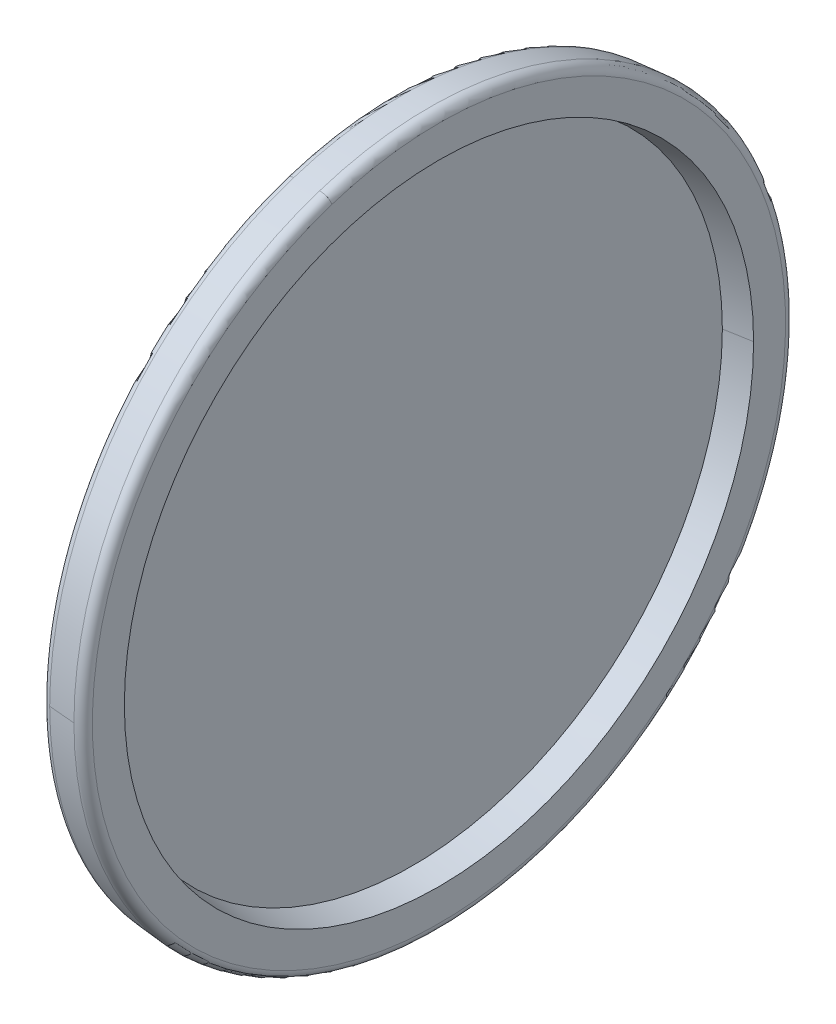
ISO-10303-21;
HEADER;
FILE_DESCRIPTION(('STEP AP214'),'2;1');
FILE_NAME('part.step','',(''),(''),'','','');
FILE_SCHEMA(('AUTOMOTIVE_DESIGN { 1 0 10303 214 1 1 1 1 }'));
ENDSEC;
DATA;
#1=APPLICATION_CONTEXT('core data for automotive mechanical design processes');
#2=APPLICATION_PROTOCOL_DEFINITION('international standard','automotive_design',2000,#1);
#3=PRODUCT_CONTEXT('',#1,'mechanical');
#4=PRODUCT('Part','Part','',(#3));
#5=PRODUCT_RELATED_PRODUCT_CATEGORY('part','',(#4));
#6=PRODUCT_DEFINITION_FORMATION('','',#4);
#7=PRODUCT_DEFINITION_CONTEXT('part definition',#1,'design');
#8=PRODUCT_DEFINITION('design','',#6,#7);
#9=PRODUCT_DEFINITION_SHAPE('','',#8);
#10=(LENGTH_UNIT() NAMED_UNIT(*) SI_UNIT(.MILLI.,.METRE.));
#11=(NAMED_UNIT(*) PLANE_ANGLE_UNIT() SI_UNIT($,.RADIAN.));
#12=(NAMED_UNIT(*) SI_UNIT($,.STERADIAN.) SOLID_ANGLE_UNIT());
#13=UNCERTAINTY_MEASURE_WITH_UNIT(LENGTH_MEASURE(1.E-05),#10,'distance_accuracy_value','');
#14=(GEOMETRIC_REPRESENTATION_CONTEXT(3) GLOBAL_UNCERTAINTY_ASSIGNED_CONTEXT((#13)) GLOBAL_UNIT_ASSIGNED_CONTEXT((#10,
#11,#12)) REPRESENTATION_CONTEXT('',''));
#15=CARTESIAN_POINT('',(0.,0.,0.));
#16=DIRECTION('',(0.,0.,1.));
#17=DIRECTION('',(1.,0.,0.));
#18=AXIS2_PLACEMENT_3D('',#15,#16,#17);
#19=CARTESIAN_POINT('',(0.,0.,0.));
#20=DIRECTION('',(1.,0.,0.));
#21=DIRECTION('',(0.,0.,-1.));
#22=AXIS2_PLACEMENT_3D('',#19,#20,#21);
#23=PLANE('',#22);
#24=CARTESIAN_POINT('',(0.,36.9925087290053,12.0195946991215));
#25=CARTESIAN_POINT('',(0.,36.7958512117207,12.6248879908821));
#26=CARTESIAN_POINT('',(0.,36.5843128120488,13.2253449829847));
#27=CARTESIAN_POINT('',(0.,36.1320393357843,14.415160900574));
#28=CARTESIAN_POINT('',(0.,35.8913042591917,15.0045198260607));
#29=CARTESIAN_POINT('',(0.,35.3812025169398,16.1707141431178));
#30=CARTESIAN_POINT('',(0.,35.1118358512804,16.7475495346883));
#31=CARTESIAN_POINT('',(0.,34.5451238415914,17.8873086508502));
#32=CARTESIAN_POINT('',(0.,34.2477784975618,18.4502323754416));
#33=CARTESIAN_POINT('',(0.,33.6258243949211,19.5608116194327));
#34=CARTESIAN_POINT('',(0.,33.3012156363099,20.1084671388325));
#35=CARTESIAN_POINT('',(0.,32.6255170013905,21.1871907310197));
#36=CARTESIAN_POINT('',(0.,32.2744271250823,21.7182588038072));
#37=CARTESIAN_POINT('',(0.,31.5466119844118,22.762528084142));
#38=CARTESIAN_POINT('',(0.,31.1698867200495,23.2757292916892));
#39=CARTESIAN_POINT('',(0.,30.3917083879606,24.2830285026871));
#40=CARTESIAN_POINT('',(0.,29.9902553202339,24.7771265061379));
#41=CARTESIAN_POINT('',(0.,29.1635885115182,25.7450289814837));
#42=CARTESIAN_POINT('',(0.,28.7383747705292,26.2188334533788));
#43=CARTESIAN_POINT('',(0.,27.8652109939093,27.1450074297003));
#44=CARTESIAN_POINT('',(0.,27.4172609582785,27.5973769341267));
#45=CARTESIAN_POINT('',(0.,26.4997037428515,28.4795911776019));
#46=CARTESIAN_POINT('',(0.,26.0300965630554,28.9094359166507));
#47=CARTESIAN_POINT('',(0.,25.0703563842326,29.7455650957842));
#48=CARTESIAN_POINT('',(0.,24.5802233852059,30.1518495358691));
#49=CARTESIAN_POINT('',(0.,23.5806123412189,30.9398793422617));
#50=CARTESIAN_POINT('',(0.,23.0711342962586,31.3216247085695));
#51=CARTESIAN_POINT('',(0.,22.0340605376472,32.0596567093864));
#52=CARTESIAN_POINT('',(0.,21.5064648239962,32.4159433438956));
#53=CARTESIAN_POINT('',(0.,20.4344267522873,33.1021995554049));
#54=CARTESIAN_POINT('',(0.,19.8899843942296,33.4321691324052));
#55=CARTESIAN_POINT('',(0.,18.7855646430361,34.064996303284));
#56=CARTESIAN_POINT('',(0.,18.2255872499003,34.3678538971626));
#57=CARTESIAN_POINT('',(0.,17.0914464631388,34.9457274913272));
#58=CARTESIAN_POINT('',(0.,16.5172830695131,35.2207434916132));
#59=CARTESIAN_POINT('',(0.,15.3561534916778,35.7422713609596));
#60=CARTESIAN_POINT('',(0.,14.7691873074682,35.9887832300198));
#61=CARTESIAN_POINT('',(0.,13.5838662014152,36.4527089682302));
#62=CARTESIAN_POINT('',(0.,12.9855112795717,36.6701228373802));
#63=CARTESIAN_POINT('',(0.,11.7788541876673,37.0753288067161));
#64=CARTESIAN_POINT('',(0.,11.1705520176063,37.2631209069019));
#65=CARTESIAN_POINT('',(0.,9.94546588247545,37.6086309306914));
#66=CARTESIAN_POINT('',(0.,9.32868191740561,37.766348854295));
#67=CARTESIAN_POINT('',(0.,8.08811807885282,38.0513305686276));
#68=CARTESIAN_POINT('',(0.,7.46433820536987,38.1785943593566));
#69=CARTESIAN_POINT('',(0.,6.21128529034277,38.4023612183211));
#70=CARTESIAN_POINT('',(0.,5.5820122487986,38.4988642865566));
#71=CARTESIAN_POINT('',(0.,4.31948897152394,38.66087721619));
#72=CARTESIAN_POINT('',(0.,3.68623873579344,38.726387077588));
#73=CARTESIAN_POINT('',(0.,2.41728662543016,38.8262557745523));
#74=CARTESIAN_POINT('',(0.,1.78158475079737,38.8606146101186));
#75=CARTESIAN_POINT('',(0.,0.509260824126409,38.8980984819753));
#76=CARTESIAN_POINT('',(0.,-0.127361227911758,38.9012235182656));
#77=CARTESIAN_POINT('',(0.,-1.39999183110863,38.8762322630842));
#78=CARTESIAN_POINT('',(0.,-2.03600038226733,38.8481159716124));
#79=CARTESIAN_POINT('',(0.,-3.30587178339773,38.7607097955155));
#80=CARTESIAN_POINT('',(0.,-3.93973463336944,38.7014199108905));
#81=CARTESIAN_POINT('',(0.,-5.20378760100046,38.5518093830123));
#82=CARTESIAN_POINT('',(0.,-5.83397771865978,38.4614887397592));
#83=CARTESIAN_POINT('',(0.,-7.08916703847443,38.2500342849656));
#84=CARTESIAN_POINT('',(0.,-7.71416624062976,38.1289004734252));
#85=CARTESIAN_POINT('',(0.,-8.95746805161499,37.8561115040192));
#86=CARTESIAN_POINT('',(0.,-9.57577066044489,37.7044563461536));
#87=CARTESIAN_POINT('',(0.,-10.8041897396377,37.3709900346559));
#88=CARTESIAN_POINT('',(0.,-11.4143062100006,37.1891788810237));
#89=CARTESIAN_POINT('',(0.,-12.6248831882423,36.7958385769869));
#90=CARTESIAN_POINT('',(0.,-13.2253436961212,36.5843094265821));
#91=CARTESIAN_POINT('',(0.,-14.4151621874374,36.1320427212511));
#92=CARTESIAN_POINT('',(0.,-15.0045201708746,35.8913051663248));
#93=CARTESIAN_POINT('',(0.,-16.1707137983037,35.3812016098067));
#94=CARTESIAN_POINT('',(0.,-16.7475494422956,35.1118356082148));
#95=CARTESIAN_POINT('',(0.,-17.8873087432428,34.545124084657));
#96=CARTESIAN_POINT('',(0.,-18.4502324001981,34.2477785626911));
#97=CARTESIAN_POINT('',(0.,-19.5608115946761,33.6258243297919));
#98=CARTESIAN_POINT('',(0.,-20.1084671321989,33.3012156188586));
#99=CARTESIAN_POINT('',(0.,-21.1871907376532,32.6255170188419));
#100=CARTESIAN_POINT('',(0.,-21.7182588055846,32.2744271297584));
#101=CARTESIAN_POINT('',(0.,-22.7625280823645,31.5466119797358));
#102=CARTESIAN_POINT('',(0.,-23.2757292912129,31.1698867187966));
#103=CARTESIAN_POINT('',(0.,-24.2830285031634,30.3917083892136));
#104=CARTESIAN_POINT('',(0.,-24.7771265062655,29.9902553205697));
#105=CARTESIAN_POINT('',(0.,-25.745028981356,29.1635885111825));
#106=CARTESIAN_POINT('',(0.,-26.2188334533445,28.7383747704393));
#107=CARTESIAN_POINT('',(0.,-27.1450074297344,27.8652109939993));
#108=CARTESIAN_POINT('',(0.,-27.5973769341359,27.4172609583026));
#109=CARTESIAN_POINT('',(0.,-28.4795911775927,26.4997037428274));
#110=CARTESIAN_POINT('',(0.,-28.9094359166482,26.0300965630489));
#111=CARTESIAN_POINT('',(0.,-29.7455650957867,25.0703563842391));
#112=CARTESIAN_POINT('',(0.,-30.1518495358697,24.5802233852077));
#113=CARTESIAN_POINT('',(0.,-30.939879342261,23.5806123412173));
#114=CARTESIAN_POINT('',(0.,-31.3216247085693,23.0711342962582));
#115=CARTESIAN_POINT('',(0.,-32.0596567093865,22.0340605376477));
#116=CARTESIAN_POINT('',(0.,-32.4159433438956,21.5064648239963));
#117=CARTESIAN_POINT('',(0.,-33.1021995554048,20.4344267522873));
#118=CARTESIAN_POINT('',(0.,-33.4321691324051,19.8899843942296));
#119=CARTESIAN_POINT('',(0.,-34.0649963032839,18.7855646430361));
#120=CARTESIAN_POINT('',(0.,-34.3678538971625,18.2255872499003));
#121=CARTESIAN_POINT('',(0.,-34.9457274913271,17.0914464631388));
#122=CARTESIAN_POINT('',(0.,-35.2207434916132,16.5172830695131));
#123=CARTESIAN_POINT('',(0.,-35.7422713609596,15.3561534916778));
#124=CARTESIAN_POINT('',(0.,-35.9887832300199,14.7691873074683));
#125=CARTESIAN_POINT('',(0.,-36.45270896823,13.5838662014153));
#126=CARTESIAN_POINT('',(0.,-36.6701228373797,12.9855112795719));
#127=CARTESIAN_POINT('',(0.,-37.0753288067165,11.7788541876672));
#128=CARTESIAN_POINT('',(0.,-37.2631209069037,11.1705520176059));
#129=CARTESIAN_POINT('',(0.,-37.6086309306896,9.94546588247601));
#130=CARTESIAN_POINT('',(0.,-37.7663488542883,9.3286819174075));
#131=CARTESIAN_POINT('',(0.,-38.0513305686342,8.0881180788511));
#132=CARTESIAN_POINT('',(0.,-38.1785943593814,7.4643382053632));
#133=CARTESIAN_POINT('',(0.,-38.4023612182962,6.2112852903496));
#134=CARTESIAN_POINT('',(0.,-38.4988642864637,5.5820122488239));
#135=CARTESIAN_POINT('',(0.,-38.6608772162829,4.31948897149882));
#136=CARTESIAN_POINT('',(0.,-38.7263870779346,3.68623873569943));
#137=CARTESIAN_POINT('',(0.,-38.8262557742057,2.41728662552432));
#138=CARTESIAN_POINT('',(0.,-38.860614608825,1.78158475114861));
#139=CARTESIAN_POINT('',(0.,-38.8980984832689,0.509260823775332));
#140=CARTESIAN_POINT('',(0.,-38.9012235230934,-0.127361229222226));
#141=CARTESIAN_POINT('',(0.,-38.8762322582564,-1.399991829798));
#142=CARTESIAN_POINT('',(0.,-38.8481159535949,-2.03600037737622));
#143=CARTESIAN_POINT('',(0.,-38.760709813533,-3.30587178828867));
#144=CARTESIAN_POINT('',(0.,-38.7014199781326,-3.9397346516229));
#145=CARTESIAN_POINT('',(0.,-38.5518093157701,-5.20378758274683));
#146=CARTESIAN_POINT('',(0.,-38.4614884888079,-5.83397765053653));
#147=CARTESIAN_POINT('',(0.,-38.2500345359169,-7.08916710659747));
#148=CARTESIAN_POINT('',(0.,-38.1289014099879,-7.71416649486871));
#149=CARTESIAN_POINT('',(0.,-37.8561105674566,-8.95746779737585));
#150=CARTESIAN_POINT('',(0.,-37.7044528508542,-9.57576971161175));
#151=CARTESIAN_POINT('',(0.,-37.3709935299553,-10.8041906884706));
#152=CARTESIAN_POINT('',(0.,-37.1891919256589,-11.4143097510936));
#153=CARTESIAN_POINT('',(0.,-36.9925087290053,-12.0195946991214));
#154=B_SPLINE_CURVE_WITH_KNOTS('',3,(#24,#25,#26,#27,#28,#29,#30,#31,#32,#33,#34,#35,#36,#37,
#38,#39,#40,#41,#42,#43,#44,#45,#46,#47,#48,#49,#50,#51,#52,#53,#54,#55,#56,#57,#58,#59,#60,#61,
#62,#63,#64,#65,#66,#67,#68,#69,#70,#71,#72,#73,#74,#75,#76,#77,#78,#79,#80,#81,#82,#83,#84,#85,
#86,#87,#88,#89,#90,#91,#92,#93,#94,#95,#96,#97,#98,#99,#100,#101,#102,#103,#104,#105,#106,#107,
#108,#109,#110,#111,#112,#113,#114,#115,#116,#117,#118,#119,#120,#121,#122,#123,#124,#125,#126,
#127,#128,#129,#130,#131,#132,#133,#134,#135,#136,#137,#138,#139,#140,#141,#142,#143,#144,#145,
#146,#147,#148,#149,#150,#151,#152,#153),.UNSPECIFIED.,.F.,.F.,(4,2,2,2,2,2,2,2,2,2,2,2,2,2,2,2,
2,2,2,2,2,2,2,2,2,2,2,2,2,2,2,2,2,2,2,2,2,2,2,2,2,2,2,2,2,2,2,2,2,2,2,2,2,2,2,2,2,2,2,2,2,2,2,2,
4),(0.,1.90912231775846,3.81824463551692,5.72736695327538,7.63648927103384,9.5456115887923,
11.4547339065508,13.3638562243092,15.2729785420677,17.1821008598262,19.0912231775846,
21.0003454953431,22.9094678131015,24.81859013086,26.7277124486184,28.6368347663769,
30.5459570841354,32.4550794018938,34.3642017196523,36.2733240374108,38.1824463551692,
40.0915686729277,42.0006909906861,43.9098133084446,45.818935626203,47.7280579439615,
49.6371802617199,51.5463025794784,53.4554248972369,55.3645472149953,57.2736695327538,
59.1827918505122,61.0919141682707,63.0010364860292,64.9101588037876,66.8192811215461,
68.7284034393045,70.637525757063,72.5466480748215,74.4557703925799,76.3648927103384,
78.2740150280968,80.1831373458553,82.0922596636138,84.0013819813722,85.9105042991307,
87.8196266168891,89.7287489346476,91.6378712524061,93.5469935701645,95.456115887923,
97.3652382056814,99.2743605234399,101.183482841198,103.092605158957,105.001727476715,
106.910849794474,108.819972112232,110.729094429991,112.638216747749,114.547339065508,
116.456461383266,118.365583701024,120.274706018783,122.183828336541),.UNSPECIFIED.);
#155=CARTESIAN_POINT('',(0.,36.9925087290053,12.0195946991215));
#156=VERTEX_POINT('',#155);
#157=CARTESIAN_POINT('',(0.,-36.9925087290053,-12.0195946991215));
#158=VERTEX_POINT('',#157);
#159=EDGE_CURVE('E11',#156,#158,#154,.T.);
#160=ORIENTED_EDGE('',*,*,#159,.F.);
#161=CARTESIAN_POINT('',(0.,-36.9925087290053,-12.0195946991215));
#162=CARTESIAN_POINT('',(0.,-36.7958512117207,-12.6248879908821));
#163=CARTESIAN_POINT('',(0.,-36.5843128120488,-13.2253449829847));
#164=CARTESIAN_POINT('',(0.,-36.1320393357843,-14.415160900574));
#165=CARTESIAN_POINT('',(0.,-35.8913042591917,-15.0045198260607));
#166=CARTESIAN_POINT('',(0.,-35.3812025169398,-16.1707141431178));
#167=CARTESIAN_POINT('',(0.,-35.1118358512804,-16.7475495346883));
#168=CARTESIAN_POINT('',(0.,-34.5451238415914,-17.8873086508502));
#169=CARTESIAN_POINT('',(0.,-34.2477784975618,-18.4502323754416));
#170=CARTESIAN_POINT('',(0.,-33.6258243949211,-19.5608116194327));
#171=CARTESIAN_POINT('',(0.,-33.3012156363099,-20.1084671388325));
#172=CARTESIAN_POINT('',(0.,-32.6255170013905,-21.1871907310197));
#173=CARTESIAN_POINT('',(0.,-32.2744271250823,-21.7182588038072));
#174=CARTESIAN_POINT('',(0.,-31.5466119844118,-22.762528084142));
#175=CARTESIAN_POINT('',(0.,-31.1698867200495,-23.2757292916892));
#176=CARTESIAN_POINT('',(0.,-30.3917083879606,-24.2830285026871));
#177=CARTESIAN_POINT('',(0.,-29.9902553202339,-24.7771265061379));
#178=CARTESIAN_POINT('',(0.,-29.1635885115182,-25.7450289814837));
#179=CARTESIAN_POINT('',(0.,-28.7383747705292,-26.2188334533787));
#180=CARTESIAN_POINT('',(0.,-27.8652109939093,-27.1450074297003));
#181=CARTESIAN_POINT('',(0.,-27.4172609582785,-27.5973769341267));
#182=CARTESIAN_POINT('',(0.,-26.4997037428515,-28.4795911776019));
#183=CARTESIAN_POINT('',(0.,-26.0300965630554,-28.9094359166506));
#184=CARTESIAN_POINT('',(0.,-25.0703563842326,-29.7455650957842));
#185=CARTESIAN_POINT('',(0.,-24.5802233852059,-30.1518495358691));
#186=CARTESIAN_POINT('',(0.,-23.580612341219,-30.9398793422617));
#187=CARTESIAN_POINT('',(0.,-23.0711342962586,-31.3216247085695));
#188=CARTESIAN_POINT('',(0.,-22.0340605376473,-32.0596567093864));
#189=CARTESIAN_POINT('',(0.,-21.5064648239962,-32.4159433438955));
#190=CARTESIAN_POINT('',(0.,-20.4344267522874,-33.1021995554049));
#191=CARTESIAN_POINT('',(0.,-19.8899843942296,-33.4321691324051));
#192=CARTESIAN_POINT('',(0.,-18.7855646430361,-34.064996303284));
#193=CARTESIAN_POINT('',(0.,-18.2255872499003,-34.3678538971625));
#194=CARTESIAN_POINT('',(0.,-17.0914464631388,-34.9457274913272));
#195=CARTESIAN_POINT('',(0.,-16.5172830695131,-35.2207434916132));
#196=CARTESIAN_POINT('',(0.,-15.3561534916778,-35.7422713609596));
#197=CARTESIAN_POINT('',(0.,-14.7691873074683,-35.9887832300198));
#198=CARTESIAN_POINT('',(0.,-13.5838662014152,-36.4527089682302));
#199=CARTESIAN_POINT('',(0.,-12.9855112795718,-36.6701228373802));
#200=CARTESIAN_POINT('',(0.,-11.7788541876673,-37.0753288067161));
#201=CARTESIAN_POINT('',(0.,-11.1705520176063,-37.2631209069019));
#202=CARTESIAN_POINT('',(0.,-9.94546588247548,-37.6086309306914));
#203=CARTESIAN_POINT('',(0.,-9.32868191740564,-37.766348854295));
#204=CARTESIAN_POINT('',(0.,-8.08811807885286,-38.0513305686276));
#205=CARTESIAN_POINT('',(0.,-7.46433820536991,-38.1785943593566));
#206=CARTESIAN_POINT('',(0.,-6.2112852903428,-38.4023612183211));
#207=CARTESIAN_POINT('',(0.,-5.58201224879864,-38.4988642865566));
#208=CARTESIAN_POINT('',(0.,-4.31948897152398,-38.66087721619));
#209=CARTESIAN_POINT('',(0.,-3.68623873579348,-38.726387077588));
#210=CARTESIAN_POINT('',(0.,-2.4172866254302,-38.8262557745523));
#211=CARTESIAN_POINT('',(0.,-1.7815847507974,-38.8606146101186));
#212=CARTESIAN_POINT('',(0.,-0.509260824126441,-38.8980984819753));
#213=CARTESIAN_POINT('',(0.,0.127361227911731,-38.9012235182656));
#214=CARTESIAN_POINT('',(0.,1.3999918311086,-38.8762322630842));
#215=CARTESIAN_POINT('',(0.,2.03600038226729,-38.8481159716124));
#216=CARTESIAN_POINT('',(0.,3.3058717833977,-38.7607097955155));
#217=CARTESIAN_POINT('',(0.,3.9397346333694,-38.7014199108905));
#218=CARTESIAN_POINT('',(0.,5.20378760100041,-38.5518093830123));
#219=CARTESIAN_POINT('',(0.,5.83397771865972,-38.4614887397592));
#220=CARTESIAN_POINT('',(0.,7.08916703847437,-38.2500342849657));
#221=CARTESIAN_POINT('',(0.,7.71416624062971,-38.1289004734252));
#222=CARTESIAN_POINT('',(0.,8.95746805161496,-37.8561115040192));
#223=CARTESIAN_POINT('',(0.,9.57577066044486,-37.7044563461536));
#224=CARTESIAN_POINT('',(0.,10.8041897396376,-37.3709900346559));
#225=CARTESIAN_POINT('',(0.,11.4143062100005,-37.1891788810237));
#226=CARTESIAN_POINT('',(0.,12.6248831882423,-36.7958385769869));
#227=CARTESIAN_POINT('',(0.,13.2253436961212,-36.5843094265821));
#228=CARTESIAN_POINT('',(0.,14.4151621874373,-36.1320427212511));
#229=CARTESIAN_POINT('',(0.,15.0045201708746,-35.8913051663248));
#230=CARTESIAN_POINT('',(0.,16.1707137983037,-35.3812016098067));
#231=CARTESIAN_POINT('',(0.,16.7475494422956,-35.1118356082148));
#232=CARTESIAN_POINT('',(0.,17.8873087432427,-34.545124084657));
#233=CARTESIAN_POINT('',(0.,18.450232400198,-34.2477785626911));
#234=CARTESIAN_POINT('',(0.,19.5608115946761,-33.6258243297919));
#235=CARTESIAN_POINT('',(0.,20.1084671321989,-33.3012156188587));
#236=CARTESIAN_POINT('',(0.,21.1871907376531,-32.6255170188419));
#237=CARTESIAN_POINT('',(0.,21.7182588055846,-32.2744271297584));
#238=CARTESIAN_POINT('',(0.,22.7625280823644,-31.5466119797358));
#239=CARTESIAN_POINT('',(0.,23.2757292912128,-31.1698867187967));
#240=CARTESIAN_POINT('',(0.,24.2830285031633,-30.3917083892136));
#241=CARTESIAN_POINT('',(0.,24.7771265062654,-29.9902553205697));
#242=CARTESIAN_POINT('',(0.,25.745028981356,-29.1635885111825));
#243=CARTESIAN_POINT('',(0.,26.2188334533445,-28.7383747704393));
#244=CARTESIAN_POINT('',(0.,27.1450074297344,-27.8652109939994));
#245=CARTESIAN_POINT('',(0.,27.5973769341358,-27.4172609583026));
#246=CARTESIAN_POINT('',(0.,28.4795911775927,-26.4997037428274));
#247=CARTESIAN_POINT('',(0.,28.9094359166481,-26.030096563049));
#248=CARTESIAN_POINT('',(0.,29.7455650957866,-25.0703563842391));
#249=CARTESIAN_POINT('',(0.,30.1518495358697,-24.5802233852077));
#250=CARTESIAN_POINT('',(0.,30.939879342261,-23.5806123412173));
#251=CARTESIAN_POINT('',(0.,31.3216247085692,-23.0711342962583));
#252=CARTESIAN_POINT('',(0.,32.0596567093865,-22.0340605376478));
#253=CARTESIAN_POINT('',(0.,32.4159433438955,-21.5064648239964));
#254=CARTESIAN_POINT('',(0.,33.1021995554048,-20.4344267522873));
#255=CARTESIAN_POINT('',(0.,33.4321691324051,-19.8899843942297));
#256=CARTESIAN_POINT('',(0.,34.0649963032839,-18.7855646430362));
#257=CARTESIAN_POINT('',(0.,34.3678538971625,-18.2255872499004));
#258=CARTESIAN_POINT('',(0.,34.9457274913271,-17.0914464631389));
#259=CARTESIAN_POINT('',(0.,35.2207434916131,-16.5172830695132));
#260=CARTESIAN_POINT('',(0.,35.7422713609596,-15.3561534916779));
#261=CARTESIAN_POINT('',(0.,35.9887832300199,-14.7691873074683));
#262=CARTESIAN_POINT('',(0.,36.45270896823,-13.5838662014154));
#263=CARTESIAN_POINT('',(0.,36.6701228373797,-12.985511279572));
#264=CARTESIAN_POINT('',(0.,37.0753288067165,-11.7788541876673));
#265=CARTESIAN_POINT('',(0.,37.2631209069037,-11.1705520176059));
#266=CARTESIAN_POINT('',(0.,37.6086309306895,-9.94546588247606));
#267=CARTESIAN_POINT('',(0.,37.7663488542883,-9.32868191740755));
#268=CARTESIAN_POINT('',(0.,38.0513305686342,-8.08811807885115));
#269=CARTESIAN_POINT('',(0.,38.1785943593814,-7.46433820536326));
#270=CARTESIAN_POINT('',(0.,38.4023612182962,-6.21128529034966));
#271=CARTESIAN_POINT('',(0.,38.4988642864637,-5.58201224882395));
#272=CARTESIAN_POINT('',(0.,38.6608772162829,-4.31948897149887));
#273=CARTESIAN_POINT('',(0.,38.7263870779346,-3.68623873569949));
#274=CARTESIAN_POINT('',(0.,38.8262557742057,-2.4172866255244));
#275=CARTESIAN_POINT('',(0.,38.860614608825,-1.78158475114868));
#276=CARTESIAN_POINT('',(0.,38.8980984832689,-0.509260823775407));
#277=CARTESIAN_POINT('',(0.,38.9012235230934,0.127361229222152));
#278=CARTESIAN_POINT('',(0.,38.8762322582564,1.39999182979793));
#279=CARTESIAN_POINT('',(0.,38.8481159535949,2.03600037737615));
#280=CARTESIAN_POINT('',(0.,38.760709813533,3.30587178828859));
#281=CARTESIAN_POINT('',(0.,38.7014199781326,3.93973465162282));
#282=CARTESIAN_POINT('',(0.,38.5518093157701,5.20378758274677));
#283=CARTESIAN_POINT('',(0.,38.461488488808,5.83397765053648));
#284=CARTESIAN_POINT('',(0.,38.2500345359169,7.08916710659743));
#285=CARTESIAN_POINT('',(0.,38.1289014099879,7.71416649486867));
#286=CARTESIAN_POINT('',(0.,37.8561105674566,8.95746779737581));
#287=CARTESIAN_POINT('',(0.,37.7044528508542,9.57576971161171));
#288=CARTESIAN_POINT('',(0.,37.3709935299553,10.8041906884706));
#289=CARTESIAN_POINT('',(0.,37.189191925659,11.4143097510936));
#290=CARTESIAN_POINT('',(0.,36.9925087290053,12.0195946991213));
#291=B_SPLINE_CURVE_WITH_KNOTS('',3,(#161,#162,#163,#164,#165,#166,#167,#168,#169,#170,#171,
#172,#173,#174,#175,#176,#177,#178,#179,#180,#181,#182,#183,#184,#185,#186,#187,#188,#189,#190,
#191,#192,#193,#194,#195,#196,#197,#198,#199,#200,#201,#202,#203,#204,#205,#206,#207,#208,#209,
#210,#211,#212,#213,#214,#215,#216,#217,#218,#219,#220,#221,#222,#223,#224,#225,#226,#227,#228,
#229,#230,#231,#232,#233,#234,#235,#236,#237,#238,#239,#240,#241,#242,#243,#244,#245,#246,#247,
#248,#249,#250,#251,#252,#253,#254,#255,#256,#257,#258,#259,#260,#261,#262,#263,#264,#265,#266,
#267,#268,#269,#270,#271,#272,#273,#274,#275,#276,#277,#278,#279,#280,#281,#282,#283,#284,#285,
#286,#287,#288,#289,#290),.UNSPECIFIED.,.F.,.F.,(4,2,2,2,2,2,2,2,2,2,2,2,2,2,2,2,2,2,2,2,2,2,2,
2,2,2,2,2,2,2,2,2,2,2,2,2,2,2,2,2,2,2,2,2,2,2,2,2,2,2,2,2,2,2,2,2,2,2,2,2,2,2,2,2,4),(0.,
1.90912231775846,3.81824463551691,5.72736695327538,7.63648927103383,9.5456115887923,
11.4547339065508,13.3638562243092,15.2729785420677,17.1821008598261,19.0912231775846,
21.000345495343,22.9094678131015,24.81859013086,26.7277124486184,28.6368347663769,
30.5459570841353,32.4550794018938,34.3642017196523,36.2733240374107,38.1824463551692,
40.0915686729276,42.0006909906861,43.9098133084445,45.818935626203,47.7280579439615,
49.6371802617199,51.5463025794784,53.4554248972368,55.3645472149953,57.2736695327538,
59.1827918505122,61.0919141682707,63.0010364860291,64.9101588037876,66.8192811215461,
68.7284034393045,70.637525757063,72.5466480748214,74.4557703925799,76.3648927103384,
78.2740150280968,80.1831373458553,82.0922596636137,84.0013819813722,85.9105042991306,
87.8196266168891,89.7287489346476,91.637871252406,93.5469935701645,95.4561158879229,
97.3652382056814,99.2743605234399,101.183482841198,103.092605158957,105.001727476715,
106.910849794474,108.819972112232,110.729094429991,112.638216747749,114.547339065508,
116.456461383266,118.365583701024,120.274706018783,122.183828336541),.UNSPECIFIED.);
#292=EDGE_CURVE('E27',#158,#156,#291,.T.);
#293=ORIENTED_EDGE('',*,*,#292,.F.);
#294=EDGE_LOOP('',(#160,#293));
#295=FACE_BOUND('',#294,.T.);
#296=ADVANCED_FACE('F17',(#295),#23,.F.);
#297=CARTESIAN_POINT('',(0.999999999999848,0.,0.));
#298=DIRECTION('',(1.,0.,0.));
#299=DIRECTION('',(0.,-0.309016994374947,0.951056516295154));
#300=AXIS2_PLACEMENT_3D('',#297,#298,#299);
#301=TOROIDAL_SURFACE('',#300,38.8962255083534,0.999999999999848);
#302=CARTESIAN_POINT('',(0.999999999999848,-36.9925087290053,-12.0195946991215));
#303=DIRECTION('',(0.,0.309016994374949,-0.951056516295153));
#304=DIRECTION('',(-0.087155742747526,-0.947437459118848,-0.307841091416575));
#305=AXIS2_PLACEMENT_3D('',#302,#303,#304);
#306=CIRCLE('',#305,0.999999999999846);
#307=CARTESIAN_POINT('',(0.912844257252335,-37.939946188124,-12.327435790538));
#308=VERTEX_POINT('',#307);
#309=EDGE_CURVE('E248',#308,#158,#306,.T.);
#310=ORIENTED_EDGE('',*,*,#309,.T.);
#311=ORIENTED_EDGE('',*,*,#292,.T.);
#312=CARTESIAN_POINT('',(0.999999999999848,36.9925087290053,12.0195946991215));
#313=DIRECTION('',(0.,-0.309016994374949,0.951056516295153));
#314=DIRECTION('',(-0.0871557427475251,0.947437459118848,0.307841091416575));
#315=AXIS2_PLACEMENT_3D('',#312,#313,#314);
#316=CIRCLE('',#315,0.999999999999846);
#317=CARTESIAN_POINT('',(0.912844257252336,37.939946188124,12.3274357905381));
#318=VERTEX_POINT('',#317);
#319=EDGE_CURVE('E243',#318,#156,#316,.T.);
#320=ORIENTED_EDGE('',*,*,#319,.F.);
#321=CARTESIAN_POINT('',(0.91284425725234,0.,0.));
#322=DIRECTION('',(1.,0.,0.));
#323=DIRECTION('',(0.,0.,-1.));
#324=AXIS2_PLACEMENT_3D('',#321,#322,#323);
#325=CIRCLE('',#324,39.892420206445);
#326=CARTESIAN_POINT('',(0.91284425725234,0.,-39.892420206445));
#327=VERTEX_POINT('',#326);
#328=EDGE_CURVE('E237',#327,#318,#325,.T.);
#329=ORIENTED_EDGE('',*,*,#328,.F.);
#330=CARTESIAN_POINT('',(0.91284425725234,0.,0.));
#331=DIRECTION('',(1.,0.,0.));
#332=DIRECTION('',(0.,0.,-1.));
#333=AXIS2_PLACEMENT_3D('',#330,#331,#332);
#334=CIRCLE('',#333,39.892420206445);
#335=EDGE_CURVE('E231',#308,#327,#334,.T.);
#336=ORIENTED_EDGE('',*,*,#335,.F.);
#337=EDGE_LOOP('',(#310,#311,#320,#329,#336));
#338=FACE_BOUND('',#337,.T.);
#339=ADVANCED_FACE('F255',(#338),#301,.T.);
#340=CARTESIAN_POINT('',(0.91284425725234,0.,0.));
#341=DIRECTION('',(1.,0.,0.));
#342=DIRECTION('',(0.,1.,0.));
#343=AXIS2_PLACEMENT_3D('',#340,#341,#342);
#344=CONICAL_SURFACE('',#343,39.892420206445,0.0872664625994641);
#345=DIRECTION('',(0.996194698091768,0.,0.0871557427474067));
#346=VECTOR('',#345,1.);
#347=CARTESIAN_POINT('',(0.912844257252397,0.,39.892420206445));
#348=LINE('',#347,#346);
#349=CARTESIAN_POINT('',(0.912844257252397,0.,39.892420206445));
#350=VERTEX_POINT('',#349);
#351=CARTESIAN_POINT('',(3.91284425725228,0.,40.154886197022));
#352=VERTEX_POINT('',#351);
#353=EDGE_CURVE('E225',#350,#352,#348,.T.);
#354=ORIENTED_EDGE('',*,*,#353,.F.);
#355=CARTESIAN_POINT('',(0.91284425725234,0.,0.));
#356=DIRECTION('',(1.,0.,0.));
#357=DIRECTION('',(0.,0.,-1.));
#358=AXIS2_PLACEMENT_3D('',#355,#356,#357);
#359=CIRCLE('',#358,39.892420206445);
#360=EDGE_CURVE('E219',#350,#308,#359,.T.);
#361=ORIENTED_EDGE('',*,*,#360,.T.);
#362=ORIENTED_EDGE('',*,*,#335,.T.);
#363=DIRECTION('',(0.996194698091768,0.,-0.0871557427474067));
#364=VECTOR('',#363,1.);
#365=CARTESIAN_POINT('',(0.912844257252397,0.,-39.892420206445));
#366=LINE('',#365,#364);
#367=CARTESIAN_POINT('',(3.9128442572523,0.,-40.154886197022));
#368=VERTEX_POINT('',#367);
#369=EDGE_CURVE('E214',#327,#368,#366,.T.);
#370=ORIENTED_EDGE('',*,*,#369,.T.);
#371=CARTESIAN_POINT('',(3.9128442572523,0.,0.));
#372=DIRECTION('',(1.,0.,0.));
#373=DIRECTION('',(0.,0.,-1.));
#374=AXIS2_PLACEMENT_3D('',#371,#372,#373);
#375=CIRCLE('',#374,40.154886197022);
#376=CARTESIAN_POINT('',(3.9128442572523,-38.1895661787681,-12.4085422420718));
#377=VERTEX_POINT('',#376);
#378=EDGE_CURVE('E208',#377,#368,#375,.T.);
#379=ORIENTED_EDGE('',*,*,#378,.F.);
#380=CARTESIAN_POINT('',(3.9128442572523,0.,0.));
#381=DIRECTION('',(1.,0.,0.));
#382=DIRECTION('',(0.,0.,-1.));
#383=AXIS2_PLACEMENT_3D('',#380,#381,#382);
#384=CIRCLE('',#383,40.154886197022);
#385=EDGE_CURVE('E202',#352,#377,#384,.T.);
#386=ORIENTED_EDGE('',*,*,#385,.F.);
#387=EDGE_LOOP('',(#354,#361,#362,#370,#379,#386));
#388=FACE_BOUND('',#387,.T.);
#389=ADVANCED_FACE('F264',(#388),#344,.T.);
#390=CARTESIAN_POINT('',(4.000000000001,0.,0.));
#391=DIRECTION('',(1.,0.,0.));
#392=DIRECTION('',(0.,0.309016994374947,-0.951056516295154));
#393=AXIS2_PLACEMENT_3D('',#390,#391,#392);
#394=TOROIDAL_SURFACE('',#393,39.1586914989313,0.999999999998996);
#395=CARTESIAN_POINT('',(4.000000000001,-37.2421287196503,-12.1007011506556));
#396=DIRECTION('',(0.,0.309016994374947,-0.951056516295154));
#397=DIRECTION('',(1.,0.,0.));
#398=AXIS2_PLACEMENT_3D('',#395,#396,#397);
#399=CIRCLE('',#398,0.999999999998996);
#400=CARTESIAN_POINT('',(5.,-37.2421287196503,-12.1007011506556));
#401=VERTEX_POINT('',#400);
#402=EDGE_CURVE('E197',#401,#377,#399,.T.);
#403=ORIENTED_EDGE('',*,*,#402,.F.);
#404=CARTESIAN_POINT('',(5.,0.,0.));
#405=DIRECTION('',(1.,0.,0.));
#406=DIRECTION('',(0.,0.,-1.));
#407=AXIS2_PLACEMENT_3D('',#404,#405,#406);
#408=CIRCLE('',#407,39.158691498931);
#409=CARTESIAN_POINT('',(5.,37.2421287196503,12.1007011506556));
#410=VERTEX_POINT('',#409);
#411=EDGE_CURVE('E191',#410,#401,#408,.T.);
#412=ORIENTED_EDGE('',*,*,#411,.F.);
#413=CARTESIAN_POINT('',(4.000000000001,37.2421287196503,12.1007011506556));
#414=DIRECTION('',(0.,-0.309016994374947,0.951056516295154));
#415=DIRECTION('',(1.,0.,0.));
#416=AXIS2_PLACEMENT_3D('',#413,#414,#415);
#417=CIRCLE('',#416,0.999999999998996);
#418=CARTESIAN_POINT('',(3.9128442572523,38.1895661787681,12.4085422420718));
#419=VERTEX_POINT('',#418);
#420=EDGE_CURVE('E186',#410,#419,#417,.T.);
#421=ORIENTED_EDGE('',*,*,#420,.T.);
#422=CARTESIAN_POINT('',(3.9128442572523,0.,0.));
#423=DIRECTION('',(1.,0.,0.));
#424=DIRECTION('',(0.,0.,-1.));
#425=AXIS2_PLACEMENT_3D('',#422,#423,#424);
#426=CIRCLE('',#425,40.154886197022);
#427=EDGE_CURVE('E180',#419,#352,#426,.T.);
#428=ORIENTED_EDGE('',*,*,#427,.T.);
#429=ORIENTED_EDGE('',*,*,#385,.T.);
#430=EDGE_LOOP('',(#403,#412,#421,#428,#429));
#431=FACE_BOUND('',#430,.T.);
#432=ADVANCED_FACE('F268',(#431),#394,.T.);
#433=CARTESIAN_POINT('',(0.91284425725234,0.,0.));
#434=DIRECTION('',(1.,0.,0.));
#435=DIRECTION('',(0.,-1.,0.));
#436=AXIS2_PLACEMENT_3D('',#433,#434,#435);
#437=CONICAL_SURFACE('',#436,39.892420206445,0.0872664625994641);
#438=ORIENTED_EDGE('',*,*,#353,.T.);
#439=ORIENTED_EDGE('',*,*,#427,.F.);
#440=CARTESIAN_POINT('',(3.9128442572523,0.,0.));
#441=DIRECTION('',(1.,0.,0.));
#442=DIRECTION('',(0.,0.,-1.));
#443=AXIS2_PLACEMENT_3D('',#440,#441,#442);
#444=CIRCLE('',#443,40.154886197022);
#445=EDGE_CURVE('E174',#368,#419,#444,.T.);
#446=ORIENTED_EDGE('',*,*,#445,.F.);
#447=ORIENTED_EDGE('',*,*,#369,.F.);
#448=ORIENTED_EDGE('',*,*,#328,.T.);
#449=CARTESIAN_POINT('',(0.91284425725234,0.,0.));
#450=DIRECTION('',(1.,0.,0.));
#451=DIRECTION('',(0.,0.,-1.));
#452=AXIS2_PLACEMENT_3D('',#449,#450,#451);
#453=CIRCLE('',#452,39.892420206445);
#454=EDGE_CURVE('E170',#318,#350,#453,.T.);
#455=ORIENTED_EDGE('',*,*,#454,.T.);
#456=EDGE_LOOP('',(#438,#439,#446,#447,#448,#455));
#457=FACE_BOUND('',#456,.T.);
#458=ADVANCED_FACE('F271',(#457),#437,.T.);
#459=CARTESIAN_POINT('',(0.999999999999848,0.,0.));
#460=DIRECTION('',(1.,0.,0.));
#461=DIRECTION('',(0.,0.309016994374947,-0.951056516295154));
#462=AXIS2_PLACEMENT_3D('',#459,#460,#461);
#463=TOROIDAL_SURFACE('',#462,38.8962255083534,0.999999999999848);
#464=ORIENTED_EDGE('',*,*,#309,.F.);
#465=ORIENTED_EDGE('',*,*,#360,.F.);
#466=ORIENTED_EDGE('',*,*,#454,.F.);
#467=ORIENTED_EDGE('',*,*,#319,.T.);
#468=ORIENTED_EDGE('',*,*,#159,.T.);
#469=EDGE_LOOP('',(#464,#465,#466,#467,#468));
#470=FACE_BOUND('',#469,.T.);
#471=ADVANCED_FACE('F138',(#470),#463,.T.);
#472=CARTESIAN_POINT('',(4.000000000001,0.,0.));
#473=DIRECTION('',(1.,0.,0.));
#474=DIRECTION('',(0.,-0.309016994374947,0.951056516295154));
#475=AXIS2_PLACEMENT_3D('',#472,#473,#474);
#476=TOROIDAL_SURFACE('',#475,39.1586914989313,0.999999999998996);
#477=ORIENTED_EDGE('',*,*,#402,.T.);
#478=ORIENTED_EDGE('',*,*,#378,.T.);
#479=ORIENTED_EDGE('',*,*,#445,.T.);
#480=ORIENTED_EDGE('',*,*,#420,.F.);
#481=CARTESIAN_POINT('',(5.,-37.24212871965,-12.1007011506555));
#482=CARTESIAN_POINT('',(5.,-35.3412778256426,-17.9506263135394));
#483=CARTESIAN_POINT('',(5.,-32.2922699038663,-23.4276750454431));
#484=CARTESIAN_POINT('',(5.,-28.1907296206391,-28.2297029027821));
#485=CARTESIAN_POINT('',(5.,-18.3258742670298,-35.9665396370473));
#486=CARTESIAN_POINT('',(5.,-6.26821753628704,-39.3998162400318));
#487=CARTESIAN_POINT('',(5.,0.0275597771698041,-39.8953153963306));
#488=CARTESIAN_POINT('',(5.,12.4738315640118,-38.3905060500562));
#489=CARTESIAN_POINT('',(5.,23.4275816974284,-32.2921873821568));
#490=CARTESIAN_POINT('',(5.,28.2297254402194,-28.1907550874451));
#491=CARTESIAN_POINT('',(5.,35.9665452934547,-18.3258631657052));
#492=CARTESIAN_POINT('',(5.,39.3997823897795,-6.26821427213021));
#493=CARTESIAN_POINT('',(5.,39.8954370263824,0.0275327620833288));
#494=CARTESIAN_POINT('',(5.,39.142807780383,6.25072015575629));
#495=CARTESIAN_POINT('',(5.,37.24212871965,12.1007011506555));
#496=B_SPLINE_CURVE_WITH_KNOTS('',5,(#481,#482,#483,#484,#485,#486,#487,#488,#489,#490,#491,
#492,#493,#494,#495),.UNSPECIFIED.,.F.,.F.,(6,3,3,3,6),(0.,0.785398163397448,1.5707963267949,
2.35619449019234,3.14159265358979),.UNSPECIFIED.);
#497=EDGE_CURVE('E158',#401,#410,#496,.T.);
#498=ORIENTED_EDGE('',*,*,#497,.F.);
#499=EDGE_LOOP('',(#477,#478,#479,#480,#498));
#500=FACE_BOUND('',#499,.T.);
#501=ADVANCED_FACE('F132',(#500),#476,.T.);
#502=CARTESIAN_POINT('',(5.,39.158691498931,0.));
#503=DIRECTION('',(-1.,0.,0.));
#504=DIRECTION('',(0.,0.,1.));
#505=AXIS2_PLACEMENT_3D('',#502,#503,#504);
#506=PLANE('',#505);
#507=CARTESIAN_POINT('',(5.,0.,0.));
#508=DIRECTION('',(1.,0.,0.));
#509=DIRECTION('',(0.,0.,-1.));
#510=AXIS2_PLACEMENT_3D('',#507,#508,#509);
#511=CIRCLE('',#510,35.546480942125);
#512=CARTESIAN_POINT('',(5.,0.,35.546480942125));
#513=VERTEX_POINT('',#512);
#514=CARTESIAN_POINT('',(5.,0.,-35.546480942125));
#515=VERTEX_POINT('',#514);
#516=EDGE_CURVE('E96',#513,#515,#511,.T.);
#517=ORIENTED_EDGE('',*,*,#516,.F.);
#518=CARTESIAN_POINT('',(5.,0.,0.));
#519=DIRECTION('',(1.,0.,0.));
#520=DIRECTION('',(0.,0.,-1.));
#521=AXIS2_PLACEMENT_3D('',#518,#519,#520);
#522=CIRCLE('',#521,35.546480942125);
#523=EDGE_CURVE('E113',#515,#513,#522,.T.);
#524=ORIENTED_EDGE('',*,*,#523,.F.);
#525=EDGE_LOOP('',(#517,#524));
#526=FACE_BOUND('',#525,.T.);
#527=ORIENTED_EDGE('',*,*,#497,.T.);
#528=ORIENTED_EDGE('',*,*,#411,.T.);
#529=EDGE_LOOP('',(#527,#528));
#530=FACE_BOUND('',#529,.T.);
#531=ADVANCED_FACE('F122',(#526,#530),#506,.F.);
#532=CARTESIAN_POINT('',(5.,0.,0.));
#533=DIRECTION('',(1.,0.,0.));
#534=DIRECTION('',(0.,-1.,0.));
#535=AXIS2_PLACEMENT_3D('',#532,#533,#534);
#536=CONICAL_SURFACE('',#535,35.546480942125,0.174532925199306);
#537=DIRECTION('',(0.98480775301223,0.,0.173648177666805));
#538=VECTOR('',#537,1.);
#539=CARTESIAN_POINT('',(2.00000000000003,0.,35.0175));
#540=LINE('',#539,#538);
#541=CARTESIAN_POINT('',(2.00000000000003,0.,35.0175));
#542=VERTEX_POINT('',#541);
#543=EDGE_CURVE('E87',#542,#513,#540,.T.);
#544=ORIENTED_EDGE('',*,*,#543,.F.);
#545=CARTESIAN_POINT('',(2.,0.,0.));
#546=DIRECTION('',(1.,0.,0.));
#547=DIRECTION('',(0.,0.,-1.));
#548=AXIS2_PLACEMENT_3D('',#545,#546,#547);
#549=CIRCLE('',#548,35.0175);
#550=CARTESIAN_POINT('',(2.,0.,-35.0175));
#551=VERTEX_POINT('',#550);
#552=EDGE_CURVE('E80',#551,#542,#549,.T.);
#553=ORIENTED_EDGE('',*,*,#552,.F.);
#554=DIRECTION('',(0.98480775301223,0.,-0.173648177666805));
#555=VECTOR('',#554,1.);
#556=CARTESIAN_POINT('',(2.00000000000003,0.,-35.0175));
#557=LINE('',#556,#555);
#558=EDGE_CURVE('E84',#551,#515,#557,.T.);
#559=ORIENTED_EDGE('',*,*,#558,.T.);
#560=ORIENTED_EDGE('',*,*,#523,.T.);
#561=EDGE_LOOP('',(#544,#553,#559,#560));
#562=FACE_BOUND('',#561,.T.);
#563=ADVANCED_FACE('F82',(#562),#536,.F.);
#564=CARTESIAN_POINT('',(5.,0.,0.));
#565=DIRECTION('',(1.,0.,0.));
#566=DIRECTION('',(0.,1.,0.));
#567=AXIS2_PLACEMENT_3D('',#564,#565,#566);
#568=CONICAL_SURFACE('',#567,35.546480942125,0.174532925199306);
#569=ORIENTED_EDGE('',*,*,#543,.T.);
#570=ORIENTED_EDGE('',*,*,#516,.T.);
#571=ORIENTED_EDGE('',*,*,#558,.F.);
#572=CARTESIAN_POINT('',(2.,0.,0.));
#573=DIRECTION('',(1.,0.,0.));
#574=DIRECTION('',(0.,0.,-1.));
#575=AXIS2_PLACEMENT_3D('',#572,#573,#574);
#576=CIRCLE('',#575,35.0175);
#577=EDGE_CURVE('E95',#542,#551,#576,.T.);
#578=ORIENTED_EDGE('',*,*,#577,.F.);
#579=EDGE_LOOP('',(#569,#570,#571,#578));
#580=FACE_BOUND('',#579,.T.);
#581=ADVANCED_FACE('F94',(#580),#568,.F.);
#582=CARTESIAN_POINT('',(2.,35.0175,0.));
#583=DIRECTION('',(-1.,0.,0.));
#584=DIRECTION('',(0.,0.,1.));
#585=AXIS2_PLACEMENT_3D('',#582,#583,#584);
#586=PLANE('',#585);
#587=ORIENTED_EDGE('',*,*,#552,.T.);
#588=ORIENTED_EDGE('',*,*,#577,.T.);
#589=EDGE_LOOP('',(#587,#588));
#590=FACE_BOUND('',#589,.T.);
#591=ADVANCED_FACE('F99',(#590),#586,.F.);
#592=CLOSED_SHELL('',(#296,#339,#389,#432,#458,#471,#501,#531,#563,#581,#591));
#593=MANIFOLD_SOLID_BREP('B1',#592);
#594=ADVANCED_BREP_SHAPE_REPRESENTATION('',(#18,#593),#14);
#595=SHAPE_DEFINITION_REPRESENTATION(#9,#594);
ENDSEC;
END-ISO-10303-21;
